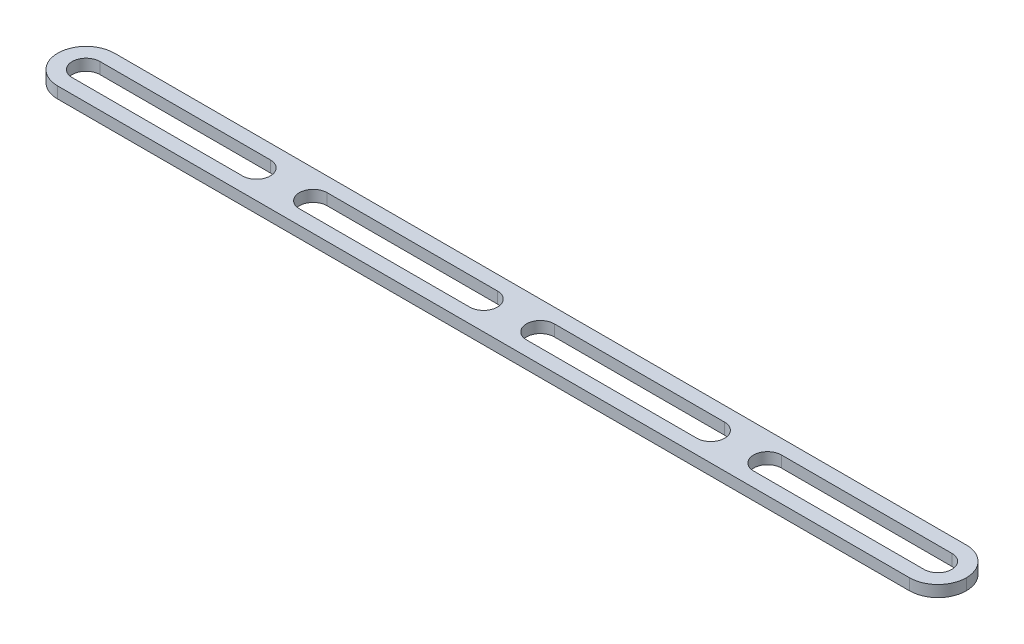
ISO-10303-21;
HEADER;
FILE_DESCRIPTION(('STEP AP214'),'2;1');
FILE_NAME('part.step','',(''),(''),'','','');
FILE_SCHEMA(('AUTOMOTIVE_DESIGN { 1 0 10303 214 1 1 1 1 }'));
ENDSEC;
DATA;
#1=APPLICATION_CONTEXT('core data for automotive mechanical design processes');
#2=APPLICATION_PROTOCOL_DEFINITION('international standard','automotive_design',2000,#1);
#3=PRODUCT_CONTEXT('',#1,'mechanical');
#4=PRODUCT('Part','Part','',(#3));
#5=PRODUCT_RELATED_PRODUCT_CATEGORY('part','',(#4));
#6=PRODUCT_DEFINITION_FORMATION('','',#4);
#7=PRODUCT_DEFINITION_CONTEXT('part definition',#1,'design');
#8=PRODUCT_DEFINITION('design','',#6,#7);
#9=PRODUCT_DEFINITION_SHAPE('','',#8);
#10=(LENGTH_UNIT() NAMED_UNIT(*) SI_UNIT(.MILLI.,.METRE.));
#11=(NAMED_UNIT(*) PLANE_ANGLE_UNIT() SI_UNIT($,.RADIAN.));
#12=(NAMED_UNIT(*) SI_UNIT($,.STERADIAN.) SOLID_ANGLE_UNIT());
#13=UNCERTAINTY_MEASURE_WITH_UNIT(LENGTH_MEASURE(1.E-05),#10,'distance_accuracy_value','');
#14=(GEOMETRIC_REPRESENTATION_CONTEXT(3) GLOBAL_UNCERTAINTY_ASSIGNED_CONTEXT((#13)) GLOBAL_UNIT_ASSIGNED_CONTEXT((#10,
#11,#12)) REPRESENTATION_CONTEXT('',''));
#15=CARTESIAN_POINT('',(0.,0.,0.));
#16=DIRECTION('',(0.,0.,1.));
#17=DIRECTION('',(1.,0.,0.));
#18=AXIS2_PLACEMENT_3D('',#15,#16,#17);
#19=CARTESIAN_POINT('',(0.,2.,0.));
#20=DIRECTION('',(0.,0.,-1.));
#21=DIRECTION('',(-1.,0.,0.));
#22=AXIS2_PLACEMENT_3D('',#19,#20,#21);
#23=PLANE('',#22);
#24=DIRECTION('',(1.,0.,0.));
#25=VECTOR('',#24,1.);
#26=CARTESIAN_POINT('',(0.,2.,0.));
#27=LINE('',#26,#25);
#28=CARTESIAN_POINT('',(5.,2.,0.));
#29=VERTEX_POINT('',#28);
#30=CARTESIAN_POINT('',(155.,2.,0.));
#31=VERTEX_POINT('',#30);
#32=EDGE_CURVE('E271',#29,#31,#27,.T.);
#33=ORIENTED_EDGE('',*,*,#32,.F.);
#34=DIRECTION('',(0.,-1.,0.));
#35=VECTOR('',#34,1.);
#36=CARTESIAN_POINT('',(5.,2.,0.));
#37=LINE('',#36,#35);
#38=CARTESIAN_POINT('',(5.,0.,0.));
#39=VERTEX_POINT('',#38);
#40=EDGE_CURVE('E286',#29,#39,#37,.T.);
#41=ORIENTED_EDGE('',*,*,#40,.T.);
#42=DIRECTION('',(1.,0.,0.));
#43=VECTOR('',#42,1.);
#44=CARTESIAN_POINT('',(0.,0.,0.));
#45=LINE('',#44,#43);
#46=CARTESIAN_POINT('',(155.,0.,0.));
#47=VERTEX_POINT('',#46);
#48=EDGE_CURVE('E279',#39,#47,#45,.T.);
#49=ORIENTED_EDGE('',*,*,#48,.T.);
#50=DIRECTION('',(0.,-1.,0.));
#51=VECTOR('',#50,1.);
#52=CARTESIAN_POINT('',(155.,2.,0.));
#53=LINE('',#52,#51);
#54=EDGE_CURVE('E278',#47,#31,#53,.F.);
#55=ORIENTED_EDGE('',*,*,#54,.T.);
#56=EDGE_LOOP('',(#33,#41,#49,#55));
#57=FACE_BOUND('',#56,.T.);
#58=ADVANCED_FACE('F34',(#57),#23,.F.);
#59=CARTESIAN_POINT('',(0.,2.,-10.));
#60=DIRECTION('',(0.,0.,1.));
#61=DIRECTION('',(1.,0.,0.));
#62=AXIS2_PLACEMENT_3D('',#59,#60,#61);
#63=PLANE('',#62);
#64=DIRECTION('',(-1.,0.,0.));
#65=VECTOR('',#64,1.);
#66=CARTESIAN_POINT('',(0.,0.,-10.));
#67=LINE('',#66,#65);
#68=CARTESIAN_POINT('',(155.,0.,-10.));
#69=VERTEX_POINT('',#68);
#70=CARTESIAN_POINT('',(5.,0.,-10.));
#71=VERTEX_POINT('',#70);
#72=EDGE_CURVE('E275',#69,#71,#67,.T.);
#73=ORIENTED_EDGE('',*,*,#72,.T.);
#74=DIRECTION('',(0.,-1.,0.));
#75=VECTOR('',#74,1.);
#76=CARTESIAN_POINT('',(5.,2.,-10.));
#77=LINE('',#76,#75);
#78=CARTESIAN_POINT('',(5.,2.,-10.));
#79=VERTEX_POINT('',#78);
#80=EDGE_CURVE('E308',#71,#79,#77,.F.);
#81=ORIENTED_EDGE('',*,*,#80,.T.);
#82=DIRECTION('',(-1.,0.,0.));
#83=VECTOR('',#82,1.);
#84=CARTESIAN_POINT('',(0.,2.,-10.));
#85=LINE('',#84,#83);
#86=CARTESIAN_POINT('',(155.,2.,-10.));
#87=VERTEX_POINT('',#86);
#88=EDGE_CURVE('E274',#87,#79,#85,.T.);
#89=ORIENTED_EDGE('',*,*,#88,.F.);
#90=DIRECTION('',(0.,-1.,0.));
#91=VECTOR('',#90,1.);
#92=CARTESIAN_POINT('',(155.,2.,-10.));
#93=LINE('',#92,#91);
#94=EDGE_CURVE('E305',#87,#69,#93,.T.);
#95=ORIENTED_EDGE('',*,*,#94,.T.);
#96=EDGE_LOOP('',(#73,#81,#89,#95));
#97=FACE_BOUND('',#96,.T.);
#98=ADVANCED_FACE('F366',(#97),#63,.F.);
#99=CARTESIAN_POINT('',(0.,2.,0.));
#100=DIRECTION('',(0.,-1.,0.));
#101=DIRECTION('',(0.,0.,-1.));
#102=AXIS2_PLACEMENT_3D('',#99,#100,#101);
#103=PLANE('',#102);
#104=DIRECTION('',(1.,0.,0.));
#105=VECTOR('',#104,1.);
#106=CARTESIAN_POINT('',(125.,2.,-2.55));
#107=LINE('',#106,#105);
#108=CARTESIAN_POINT('',(125.,2.,-2.55));
#109=VERTEX_POINT('',#108);
#110=CARTESIAN_POINT('',(155.,2.,-2.55));
#111=VERTEX_POINT('',#110);
#112=EDGE_CURVE('E194',#109,#111,#107,.T.);
#113=ORIENTED_EDGE('',*,*,#112,.F.);
#114=CARTESIAN_POINT('',(125.,2.,-5.));
#115=DIRECTION('',(0.,1.,0.));
#116=DIRECTION('',(0.,0.,1.));
#117=AXIS2_PLACEMENT_3D('',#114,#115,#116);
#118=CIRCLE('',#117,2.45);
#119=CARTESIAN_POINT('',(125.,2.,-7.45));
#120=VERTEX_POINT('',#119);
#121=EDGE_CURVE('E49',#120,#109,#118,.T.);
#122=ORIENTED_EDGE('',*,*,#121,.F.);
#123=DIRECTION('',(-1.,0.,0.));
#124=VECTOR('',#123,1.);
#125=CARTESIAN_POINT('',(125.,2.,-7.45));
#126=LINE('',#125,#124);
#127=CARTESIAN_POINT('',(155.,2.,-7.45));
#128=VERTEX_POINT('',#127);
#129=EDGE_CURVE('E201',#128,#120,#126,.T.);
#130=ORIENTED_EDGE('',*,*,#129,.F.);
#131=CARTESIAN_POINT('',(155.,2.,-5.));
#132=DIRECTION('',(0.,1.,0.));
#133=DIRECTION('',(0.,0.,1.));
#134=AXIS2_PLACEMENT_3D('',#131,#132,#133);
#135=CIRCLE('',#134,2.45);
#136=EDGE_CURVE('E185',#111,#128,#135,.T.);
#137=ORIENTED_EDGE('',*,*,#136,.F.);
#138=EDGE_LOOP('',(#113,#122,#130,#137));
#139=FACE_BOUND('',#138,.T.);
#140=DIRECTION('',(1.,0.,0.));
#141=VECTOR('',#140,1.);
#142=CARTESIAN_POINT('',(85.,2.,-2.55));
#143=LINE('',#142,#141);
#144=CARTESIAN_POINT('',(85.,2.,-2.55));
#145=VERTEX_POINT('',#144);
#146=CARTESIAN_POINT('',(115.,2.,-2.55));
#147=VERTEX_POINT('',#146);
#148=EDGE_CURVE('E212',#145,#147,#143,.T.);
#149=ORIENTED_EDGE('',*,*,#148,.F.);
#150=CARTESIAN_POINT('',(85.,2.,-5.));
#151=DIRECTION('',(0.,1.,0.));
#152=DIRECTION('',(0.,0.,1.));
#153=AXIS2_PLACEMENT_3D('',#150,#151,#152);
#154=CIRCLE('',#153,2.45);
#155=CARTESIAN_POINT('',(85.,2.,-7.45));
#156=VERTEX_POINT('',#155);
#157=EDGE_CURVE('E208',#156,#145,#154,.T.);
#158=ORIENTED_EDGE('',*,*,#157,.F.);
#159=DIRECTION('',(-1.,0.,0.));
#160=VECTOR('',#159,1.);
#161=CARTESIAN_POINT('',(85.,2.,-7.45));
#162=LINE('',#161,#160);
#163=CARTESIAN_POINT('',(115.,2.,-7.45));
#164=VERTEX_POINT('',#163);
#165=EDGE_CURVE('E218',#164,#156,#162,.T.);
#166=ORIENTED_EDGE('',*,*,#165,.F.);
#167=CARTESIAN_POINT('',(115.,2.,-5.));
#168=DIRECTION('',(0.,1.,0.));
#169=DIRECTION('',(0.,0.,1.));
#170=AXIS2_PLACEMENT_3D('',#167,#168,#169);
#171=CIRCLE('',#170,2.45);
#172=EDGE_CURVE('E215',#147,#164,#171,.T.);
#173=ORIENTED_EDGE('',*,*,#172,.F.);
#174=EDGE_LOOP('',(#149,#158,#166,#173));
#175=FACE_BOUND('',#174,.T.);
#176=DIRECTION('',(1.,0.,0.));
#177=VECTOR('',#176,1.);
#178=CARTESIAN_POINT('',(45.,2.,-2.55));
#179=LINE('',#178,#177);
#180=CARTESIAN_POINT('',(45.,2.,-2.55));
#181=VERTEX_POINT('',#180);
#182=CARTESIAN_POINT('',(75.,2.,-2.55));
#183=VERTEX_POINT('',#182);
#184=EDGE_CURVE('E232',#181,#183,#179,.T.);
#185=ORIENTED_EDGE('',*,*,#184,.F.);
#186=CARTESIAN_POINT('',(45.,2.,-5.));
#187=DIRECTION('',(0.,1.,0.));
#188=DIRECTION('',(0.,0.,1.));
#189=AXIS2_PLACEMENT_3D('',#186,#187,#188);
#190=CIRCLE('',#189,2.45);
#191=CARTESIAN_POINT('',(45.,2.,-7.45));
#192=VERTEX_POINT('',#191);
#193=EDGE_CURVE('E224',#192,#181,#190,.T.);
#194=ORIENTED_EDGE('',*,*,#193,.F.);
#195=DIRECTION('',(-1.,0.,0.));
#196=VECTOR('',#195,1.);
#197=CARTESIAN_POINT('',(45.,2.,-7.45));
#198=LINE('',#197,#196);
#199=CARTESIAN_POINT('',(75.,2.,-7.45));
#200=VERTEX_POINT('',#199);
#201=EDGE_CURVE('E238',#200,#192,#198,.T.);
#202=ORIENTED_EDGE('',*,*,#201,.F.);
#203=CARTESIAN_POINT('',(75.,2.,-5.));
#204=DIRECTION('',(0.,1.,0.));
#205=DIRECTION('',(0.,0.,1.));
#206=AXIS2_PLACEMENT_3D('',#203,#204,#205);
#207=CIRCLE('',#206,2.45);
#208=EDGE_CURVE('E235',#183,#200,#207,.T.);
#209=ORIENTED_EDGE('',*,*,#208,.F.);
#210=EDGE_LOOP('',(#185,#194,#202,#209));
#211=FACE_BOUND('',#210,.T.);
#212=DIRECTION('',(1.,0.,0.));
#213=VECTOR('',#212,1.);
#214=CARTESIAN_POINT('',(5.,2.,-2.55));
#215=LINE('',#214,#213);
#216=CARTESIAN_POINT('',(5.,2.,-2.55));
#217=VERTEX_POINT('',#216);
#218=CARTESIAN_POINT('',(35.,2.,-2.55));
#219=VERTEX_POINT('',#218);
#220=EDGE_CURVE('E252',#217,#219,#215,.T.);
#221=ORIENTED_EDGE('',*,*,#220,.F.);
#222=CARTESIAN_POINT('',(5.,2.,-5.));
#223=DIRECTION('',(0.,1.,0.));
#224=DIRECTION('',(0.,0.,1.));
#225=AXIS2_PLACEMENT_3D('',#222,#223,#224);
#226=CIRCLE('',#225,2.45);
#227=CARTESIAN_POINT('',(5.,2.,-7.45));
#228=VERTEX_POINT('',#227);
#229=EDGE_CURVE('E244',#228,#217,#226,.T.);
#230=ORIENTED_EDGE('',*,*,#229,.F.);
#231=DIRECTION('',(-1.,0.,0.));
#232=VECTOR('',#231,1.);
#233=CARTESIAN_POINT('',(5.,2.,-7.45));
#234=LINE('',#233,#232);
#235=CARTESIAN_POINT('',(35.,2.,-7.45));
#236=VERTEX_POINT('',#235);
#237=EDGE_CURVE('E258',#236,#228,#234,.T.);
#238=ORIENTED_EDGE('',*,*,#237,.F.);
#239=CARTESIAN_POINT('',(35.,2.,-5.));
#240=DIRECTION('',(0.,1.,0.));
#241=DIRECTION('',(0.,0.,1.));
#242=AXIS2_PLACEMENT_3D('',#239,#240,#241);
#243=CIRCLE('',#242,2.45);
#244=EDGE_CURVE('E255',#219,#236,#243,.T.);
#245=ORIENTED_EDGE('',*,*,#244,.F.);
#246=EDGE_LOOP('',(#221,#230,#238,#245));
#247=FACE_BOUND('',#246,.T.);
#248=CARTESIAN_POINT('',(5.,2.,-5.));
#249=DIRECTION('',(0.,-1.,0.));
#250=DIRECTION('',(0.,0.,-1.));
#251=AXIS2_PLACEMENT_3D('',#248,#249,#250);
#252=CIRCLE('',#251,5.);
#253=CARTESIAN_POINT('',(0.,2.,-5.));
#254=VERTEX_POINT('',#253);
#255=EDGE_CURVE('E301',#79,#254,#252,.F.);
#256=ORIENTED_EDGE('',*,*,#255,.T.);
#257=CARTESIAN_POINT('',(5.,2.,-5.));
#258=DIRECTION('',(0.,-1.,0.));
#259=DIRECTION('',(0.,0.,-1.));
#260=AXIS2_PLACEMENT_3D('',#257,#258,#259);
#261=CIRCLE('',#260,5.);
#262=EDGE_CURVE('E303',#254,#29,#261,.F.);
#263=ORIENTED_EDGE('',*,*,#262,.T.);
#264=ORIENTED_EDGE('',*,*,#32,.T.);
#265=CARTESIAN_POINT('',(155.,2.,-5.));
#266=DIRECTION('',(0.,-1.,0.));
#267=DIRECTION('',(0.,0.,-1.));
#268=AXIS2_PLACEMENT_3D('',#265,#266,#267);
#269=CIRCLE('',#268,5.);
#270=CARTESIAN_POINT('',(160.,2.,-5.));
#271=VERTEX_POINT('',#270);
#272=EDGE_CURVE('E297',#31,#271,#269,.F.);
#273=ORIENTED_EDGE('',*,*,#272,.T.);
#274=CARTESIAN_POINT('',(155.,2.,-5.));
#275=DIRECTION('',(0.,-1.,0.));
#276=DIRECTION('',(0.,0.,-1.));
#277=AXIS2_PLACEMENT_3D('',#274,#275,#276);
#278=CIRCLE('',#277,5.);
#279=EDGE_CURVE('E299',#271,#87,#278,.F.);
#280=ORIENTED_EDGE('',*,*,#279,.T.);
#281=ORIENTED_EDGE('',*,*,#88,.T.);
#282=EDGE_LOOP('',(#256,#263,#264,#273,#280,#281));
#283=FACE_BOUND('',#282,.T.);
#284=ADVANCED_FACE('F198',(#139,#175,#211,#247,#283),#103,.F.);
#285=CARTESIAN_POINT('',(0.,0.,0.));
#286=DIRECTION('',(0.,-1.,0.));
#287=DIRECTION('',(0.,0.,-1.));
#288=AXIS2_PLACEMENT_3D('',#285,#286,#287);
#289=PLANE('',#288);
#290=CARTESIAN_POINT('',(125.,0.,-5.));
#291=DIRECTION('',(0.,-1.,0.));
#292=DIRECTION('',(0.,0.,-1.));
#293=AXIS2_PLACEMENT_3D('',#290,#291,#292);
#294=CIRCLE('',#293,2.45);
#295=CARTESIAN_POINT('',(125.,0.,-2.55));
#296=VERTEX_POINT('',#295);
#297=CARTESIAN_POINT('',(125.,0.,-7.45));
#298=VERTEX_POINT('',#297);
#299=EDGE_CURVE('E11',#296,#298,#294,.T.);
#300=ORIENTED_EDGE('',*,*,#299,.F.);
#301=DIRECTION('',(-1.,0.,0.));
#302=VECTOR('',#301,1.);
#303=CARTESIAN_POINT('',(0.,0.,-2.55));
#304=LINE('',#303,#302);
#305=CARTESIAN_POINT('',(155.,0.,-2.55));
#306=VERTEX_POINT('',#305);
#307=EDGE_CURVE('E341',#306,#296,#304,.T.);
#308=ORIENTED_EDGE('',*,*,#307,.F.);
#309=CARTESIAN_POINT('',(155.,0.,-5.));
#310=DIRECTION('',(0.,-1.,0.));
#311=DIRECTION('',(0.,0.,-1.));
#312=AXIS2_PLACEMENT_3D('',#309,#310,#311);
#313=CIRCLE('',#312,2.45);
#314=CARTESIAN_POINT('',(155.,0.,-7.45));
#315=VERTEX_POINT('',#314);
#316=EDGE_CURVE('E188',#315,#306,#313,.T.);
#317=ORIENTED_EDGE('',*,*,#316,.F.);
#318=DIRECTION('',(1.,0.,0.));
#319=VECTOR('',#318,1.);
#320=CARTESIAN_POINT('',(0.,0.,-7.45));
#321=LINE('',#320,#319);
#322=EDGE_CURVE('E42',#298,#315,#321,.T.);
#323=ORIENTED_EDGE('',*,*,#322,.F.);
#324=EDGE_LOOP('',(#300,#308,#317,#323));
#325=FACE_BOUND('',#324,.T.);
#326=CARTESIAN_POINT('',(85.,0.,-5.));
#327=DIRECTION('',(0.,-1.,0.));
#328=DIRECTION('',(0.,0.,-1.));
#329=AXIS2_PLACEMENT_3D('',#326,#327,#328);
#330=CIRCLE('',#329,2.45);
#331=CARTESIAN_POINT('',(85.,0.,-2.55));
#332=VERTEX_POINT('',#331);
#333=CARTESIAN_POINT('',(85.,0.,-7.45));
#334=VERTEX_POINT('',#333);
#335=EDGE_CURVE('E339',#332,#334,#330,.T.);
#336=ORIENTED_EDGE('',*,*,#335,.F.);
#337=DIRECTION('',(-1.,0.,0.));
#338=VECTOR('',#337,1.);
#339=CARTESIAN_POINT('',(0.,0.,-2.55));
#340=LINE('',#339,#338);
#341=CARTESIAN_POINT('',(115.,0.,-2.55));
#342=VERTEX_POINT('',#341);
#343=EDGE_CURVE('E332',#342,#332,#340,.T.);
#344=ORIENTED_EDGE('',*,*,#343,.F.);
#345=CARTESIAN_POINT('',(115.,0.,-5.));
#346=DIRECTION('',(0.,-1.,0.));
#347=DIRECTION('',(0.,0.,-1.));
#348=AXIS2_PLACEMENT_3D('',#345,#346,#347);
#349=CIRCLE('',#348,2.45);
#350=CARTESIAN_POINT('',(115.,0.,-7.45));
#351=VERTEX_POINT('',#350);
#352=EDGE_CURVE('E334',#351,#342,#349,.T.);
#353=ORIENTED_EDGE('',*,*,#352,.F.);
#354=DIRECTION('',(1.,0.,0.));
#355=VECTOR('',#354,1.);
#356=CARTESIAN_POINT('',(0.,0.,-7.45));
#357=LINE('',#356,#355);
#358=EDGE_CURVE('E337',#334,#351,#357,.T.);
#359=ORIENTED_EDGE('',*,*,#358,.F.);
#360=EDGE_LOOP('',(#336,#344,#353,#359));
#361=FACE_BOUND('',#360,.T.);
#362=CARTESIAN_POINT('',(45.,0.,-5.));
#363=DIRECTION('',(0.,-1.,0.));
#364=DIRECTION('',(0.,0.,-1.));
#365=AXIS2_PLACEMENT_3D('',#362,#363,#364);
#366=CIRCLE('',#365,2.45);
#367=CARTESIAN_POINT('',(45.,0.,-2.55));
#368=VERTEX_POINT('',#367);
#369=CARTESIAN_POINT('',(45.,0.,-7.45));
#370=VERTEX_POINT('',#369);
#371=EDGE_CURVE('E330',#368,#370,#366,.T.);
#372=ORIENTED_EDGE('',*,*,#371,.F.);
#373=DIRECTION('',(-1.,0.,0.));
#374=VECTOR('',#373,1.);
#375=CARTESIAN_POINT('',(0.,0.,-2.55));
#376=LINE('',#375,#374);
#377=CARTESIAN_POINT('',(75.,0.,-2.55));
#378=VERTEX_POINT('',#377);
#379=EDGE_CURVE('E323',#378,#368,#376,.T.);
#380=ORIENTED_EDGE('',*,*,#379,.F.);
#381=CARTESIAN_POINT('',(75.,0.,-5.));
#382=DIRECTION('',(0.,-1.,0.));
#383=DIRECTION('',(0.,0.,-1.));
#384=AXIS2_PLACEMENT_3D('',#381,#382,#383);
#385=CIRCLE('',#384,2.45);
#386=CARTESIAN_POINT('',(75.,0.,-7.45));
#387=VERTEX_POINT('',#386);
#388=EDGE_CURVE('E325',#387,#378,#385,.T.);
#389=ORIENTED_EDGE('',*,*,#388,.F.);
#390=DIRECTION('',(1.,0.,0.));
#391=VECTOR('',#390,1.);
#392=CARTESIAN_POINT('',(0.,0.,-7.45));
#393=LINE('',#392,#391);
#394=EDGE_CURVE('E328',#370,#387,#393,.T.);
#395=ORIENTED_EDGE('',*,*,#394,.F.);
#396=EDGE_LOOP('',(#372,#380,#389,#395));
#397=FACE_BOUND('',#396,.T.);
#398=CARTESIAN_POINT('',(5.,0.,-5.));
#399=DIRECTION('',(0.,-1.,0.));
#400=DIRECTION('',(0.,0.,-1.));
#401=AXIS2_PLACEMENT_3D('',#398,#399,#400);
#402=CIRCLE('',#401,2.45);
#403=CARTESIAN_POINT('',(5.,0.,-2.55));
#404=VERTEX_POINT('',#403);
#405=CARTESIAN_POINT('',(5.,0.,-7.45));
#406=VERTEX_POINT('',#405);
#407=EDGE_CURVE('E321',#404,#406,#402,.T.);
#408=ORIENTED_EDGE('',*,*,#407,.F.);
#409=DIRECTION('',(-1.,0.,0.));
#410=VECTOR('',#409,1.);
#411=CARTESIAN_POINT('',(0.,0.,-2.55));
#412=LINE('',#411,#410);
#413=CARTESIAN_POINT('',(35.,0.,-2.55));
#414=VERTEX_POINT('',#413);
#415=EDGE_CURVE('E310',#414,#404,#412,.T.);
#416=ORIENTED_EDGE('',*,*,#415,.F.);
#417=CARTESIAN_POINT('',(35.,0.,-5.));
#418=DIRECTION('',(0.,-1.,0.));
#419=DIRECTION('',(0.,0.,-1.));
#420=AXIS2_PLACEMENT_3D('',#417,#418,#419);
#421=CIRCLE('',#420,2.45);
#422=CARTESIAN_POINT('',(35.,0.,-7.45));
#423=VERTEX_POINT('',#422);
#424=EDGE_CURVE('E316',#423,#414,#421,.T.);
#425=ORIENTED_EDGE('',*,*,#424,.F.);
#426=DIRECTION('',(1.,0.,0.));
#427=VECTOR('',#426,1.);
#428=CARTESIAN_POINT('',(0.,0.,-7.45));
#429=LINE('',#428,#427);
#430=EDGE_CURVE('E319',#406,#423,#429,.T.);
#431=ORIENTED_EDGE('',*,*,#430,.F.);
#432=EDGE_LOOP('',(#408,#416,#425,#431));
#433=FACE_BOUND('',#432,.T.);
#434=ORIENTED_EDGE('',*,*,#48,.F.);
#435=CARTESIAN_POINT('',(5.,0.,-5.));
#436=DIRECTION('',(0.,-1.,0.));
#437=DIRECTION('',(0.,0.,-1.));
#438=AXIS2_PLACEMENT_3D('',#435,#436,#437);
#439=CIRCLE('',#438,5.);
#440=CARTESIAN_POINT('',(0.,0.,-5.));
#441=VERTEX_POINT('',#440);
#442=EDGE_CURVE('E295',#39,#441,#439,.T.);
#443=ORIENTED_EDGE('',*,*,#442,.T.);
#444=CARTESIAN_POINT('',(5.,0.,-5.));
#445=DIRECTION('',(0.,-1.,0.));
#446=DIRECTION('',(0.,0.,-1.));
#447=AXIS2_PLACEMENT_3D('',#444,#445,#446);
#448=CIRCLE('',#447,5.);
#449=EDGE_CURVE('E293',#441,#71,#448,.T.);
#450=ORIENTED_EDGE('',*,*,#449,.T.);
#451=ORIENTED_EDGE('',*,*,#72,.F.);
#452=CARTESIAN_POINT('',(155.,0.,-5.));
#453=DIRECTION('',(0.,-1.,0.));
#454=DIRECTION('',(0.,0.,-1.));
#455=AXIS2_PLACEMENT_3D('',#452,#453,#454);
#456=CIRCLE('',#455,5.);
#457=CARTESIAN_POINT('',(160.,0.,-5.));
#458=VERTEX_POINT('',#457);
#459=EDGE_CURVE('E291',#69,#458,#456,.T.);
#460=ORIENTED_EDGE('',*,*,#459,.T.);
#461=CARTESIAN_POINT('',(155.,0.,-5.));
#462=DIRECTION('',(0.,-1.,0.));
#463=DIRECTION('',(0.,0.,-1.));
#464=AXIS2_PLACEMENT_3D('',#461,#462,#463);
#465=CIRCLE('',#464,5.);
#466=EDGE_CURVE('E289',#458,#47,#465,.T.);
#467=ORIENTED_EDGE('',*,*,#466,.T.);
#468=EDGE_LOOP('',(#434,#443,#450,#451,#460,#467));
#469=FACE_BOUND('',#468,.T.);
#470=ADVANCED_FACE('F349',(#325,#361,#397,#433,#469),#289,.T.);
#471=CARTESIAN_POINT('',(5.,2.,-5.));
#472=DIRECTION('',(0.,-1.,0.));
#473=DIRECTION('',(0.,0.,-1.));
#474=AXIS2_PLACEMENT_3D('',#471,#472,#473);
#475=CYLINDRICAL_SURFACE('',#474,5.);
#476=DIRECTION('',(0.,-1.,0.));
#477=VECTOR('',#476,1.);
#478=CARTESIAN_POINT('',(0.,2.,-5.));
#479=LINE('',#478,#477);
#480=EDGE_CURVE('E282',#254,#441,#479,.T.);
#481=ORIENTED_EDGE('',*,*,#480,.F.);
#482=ORIENTED_EDGE('',*,*,#255,.F.);
#483=ORIENTED_EDGE('',*,*,#80,.F.);
#484=ORIENTED_EDGE('',*,*,#449,.F.);
#485=EDGE_LOOP('',(#481,#482,#483,#484));
#486=FACE_BOUND('',#485,.T.);
#487=ADVANCED_FACE('F380',(#486),#475,.T.);
#488=CARTESIAN_POINT('',(5.,2.,-5.));
#489=DIRECTION('',(0.,-1.,0.));
#490=DIRECTION('',(0.,0.,-1.));
#491=AXIS2_PLACEMENT_3D('',#488,#489,#490);
#492=CYLINDRICAL_SURFACE('',#491,5.);
#493=ORIENTED_EDGE('',*,*,#262,.F.);
#494=ORIENTED_EDGE('',*,*,#480,.T.);
#495=ORIENTED_EDGE('',*,*,#442,.F.);
#496=ORIENTED_EDGE('',*,*,#40,.F.);
#497=EDGE_LOOP('',(#493,#494,#495,#496));
#498=FACE_BOUND('',#497,.T.);
#499=ADVANCED_FACE('F377',(#498),#492,.T.);
#500=CARTESIAN_POINT('',(155.,2.,-5.));
#501=DIRECTION('',(0.,-1.,0.));
#502=DIRECTION('',(0.,0.,-1.));
#503=AXIS2_PLACEMENT_3D('',#500,#501,#502);
#504=CYLINDRICAL_SURFACE('',#503,5.);
#505=DIRECTION('',(0.,-1.,0.));
#506=VECTOR('',#505,1.);
#507=CARTESIAN_POINT('',(160.,2.,-5.));
#508=LINE('',#507,#506);
#509=EDGE_CURVE('E264',#271,#458,#508,.T.);
#510=ORIENTED_EDGE('',*,*,#509,.F.);
#511=ORIENTED_EDGE('',*,*,#272,.F.);
#512=ORIENTED_EDGE('',*,*,#54,.F.);
#513=ORIENTED_EDGE('',*,*,#466,.F.);
#514=EDGE_LOOP('',(#510,#511,#512,#513));
#515=FACE_BOUND('',#514,.T.);
#516=ADVANCED_FACE('F36',(#515),#504,.T.);
#517=CARTESIAN_POINT('',(155.,2.,-5.));
#518=DIRECTION('',(0.,-1.,0.));
#519=DIRECTION('',(0.,0.,-1.));
#520=AXIS2_PLACEMENT_3D('',#517,#518,#519);
#521=CYLINDRICAL_SURFACE('',#520,5.);
#522=ORIENTED_EDGE('',*,*,#279,.F.);
#523=ORIENTED_EDGE('',*,*,#509,.T.);
#524=ORIENTED_EDGE('',*,*,#459,.F.);
#525=ORIENTED_EDGE('',*,*,#94,.F.);
#526=EDGE_LOOP('',(#522,#523,#524,#525));
#527=FACE_BOUND('',#526,.T.);
#528=ADVANCED_FACE('F384',(#527),#521,.T.);
#529=CARTESIAN_POINT('',(5.,-8.,-5.));
#530=DIRECTION('',(0.,1.,0.));
#531=DIRECTION('',(0.,0.,1.));
#532=AXIS2_PLACEMENT_3D('',#529,#530,#531);
#533=CYLINDRICAL_SURFACE('',#532,2.45);
#534=ORIENTED_EDGE('',*,*,#407,.T.);
#535=DIRECTION('',(0.,1.,0.));
#536=VECTOR('',#535,1.);
#537=CARTESIAN_POINT('',(5.,-8.,-7.45));
#538=LINE('',#537,#536);
#539=EDGE_CURVE('E262',#406,#228,#538,.T.);
#540=ORIENTED_EDGE('',*,*,#539,.T.);
#541=ORIENTED_EDGE('',*,*,#229,.T.);
#542=DIRECTION('',(0.,1.,0.));
#543=VECTOR('',#542,1.);
#544=CARTESIAN_POINT('',(5.,-8.,-2.55));
#545=LINE('',#544,#543);
#546=EDGE_CURVE('E261',#404,#217,#545,.T.);
#547=ORIENTED_EDGE('',*,*,#546,.F.);
#548=EDGE_LOOP('',(#534,#540,#541,#547));
#549=FACE_BOUND('',#548,.T.);
#550=ADVANCED_FACE('F386',(#549),#533,.F.);
#551=CARTESIAN_POINT('',(5.,-8.,-7.45));
#552=DIRECTION('',(0.,0.,-1.));
#553=DIRECTION('',(-1.,0.,0.));
#554=AXIS2_PLACEMENT_3D('',#551,#552,#553);
#555=PLANE('',#554);
#556=ORIENTED_EDGE('',*,*,#430,.T.);
#557=DIRECTION('',(0.,1.,0.));
#558=VECTOR('',#557,1.);
#559=CARTESIAN_POINT('',(35.,-8.,-7.45));
#560=LINE('',#559,#558);
#561=EDGE_CURVE('E265',#423,#236,#560,.T.);
#562=ORIENTED_EDGE('',*,*,#561,.T.);
#563=ORIENTED_EDGE('',*,*,#237,.T.);
#564=ORIENTED_EDGE('',*,*,#539,.F.);
#565=EDGE_LOOP('',(#556,#562,#563,#564));
#566=FACE_BOUND('',#565,.T.);
#567=ADVANCED_FACE('F392',(#566),#555,.F.);
#568=CARTESIAN_POINT('',(35.,-8.,-5.));
#569=DIRECTION('',(0.,1.,0.));
#570=DIRECTION('',(0.,0.,1.));
#571=AXIS2_PLACEMENT_3D('',#568,#569,#570);
#572=CYLINDRICAL_SURFACE('',#571,2.45);
#573=ORIENTED_EDGE('',*,*,#424,.T.);
#574=DIRECTION('',(0.,1.,0.));
#575=VECTOR('',#574,1.);
#576=CARTESIAN_POINT('',(35.,-8.,-2.55));
#577=LINE('',#576,#575);
#578=EDGE_CURVE('E267',#414,#219,#577,.T.);
#579=ORIENTED_EDGE('',*,*,#578,.T.);
#580=ORIENTED_EDGE('',*,*,#244,.T.);
#581=ORIENTED_EDGE('',*,*,#561,.F.);
#582=EDGE_LOOP('',(#573,#579,#580,#581));
#583=FACE_BOUND('',#582,.T.);
#584=ADVANCED_FACE('F423',(#583),#572,.F.);
#585=CARTESIAN_POINT('',(5.,-8.,-2.55));
#586=DIRECTION('',(0.,0.,1.));
#587=DIRECTION('',(1.,0.,0.));
#588=AXIS2_PLACEMENT_3D('',#585,#586,#587);
#589=PLANE('',#588);
#590=ORIENTED_EDGE('',*,*,#415,.T.);
#591=ORIENTED_EDGE('',*,*,#546,.T.);
#592=ORIENTED_EDGE('',*,*,#220,.T.);
#593=ORIENTED_EDGE('',*,*,#578,.F.);
#594=EDGE_LOOP('',(#590,#591,#592,#593));
#595=FACE_BOUND('',#594,.T.);
#596=ADVANCED_FACE('F419',(#595),#589,.F.);
#597=CARTESIAN_POINT('',(45.,-8.,-5.));
#598=DIRECTION('',(0.,1.,0.));
#599=DIRECTION('',(0.,0.,1.));
#600=AXIS2_PLACEMENT_3D('',#597,#598,#599);
#601=CYLINDRICAL_SURFACE('',#600,2.45);
#602=ORIENTED_EDGE('',*,*,#371,.T.);
#603=DIRECTION('',(0.,1.,0.));
#604=VECTOR('',#603,1.);
#605=CARTESIAN_POINT('',(45.,-8.,-7.45));
#606=LINE('',#605,#604);
#607=EDGE_CURVE('E242',#370,#192,#606,.T.);
#608=ORIENTED_EDGE('',*,*,#607,.T.);
#609=ORIENTED_EDGE('',*,*,#193,.T.);
#610=DIRECTION('',(0.,1.,0.));
#611=VECTOR('',#610,1.);
#612=CARTESIAN_POINT('',(45.,-8.,-2.55));
#613=LINE('',#612,#611);
#614=EDGE_CURVE('E241',#368,#181,#613,.T.);
#615=ORIENTED_EDGE('',*,*,#614,.F.);
#616=EDGE_LOOP('',(#602,#608,#609,#615));
#617=FACE_BOUND('',#616,.T.);
#618=ADVANCED_FACE('F422',(#617),#601,.F.);
#619=CARTESIAN_POINT('',(45.,-8.,-7.45));
#620=DIRECTION('',(0.,0.,-1.));
#621=DIRECTION('',(-1.,0.,0.));
#622=AXIS2_PLACEMENT_3D('',#619,#620,#621);
#623=PLANE('',#622);
#624=ORIENTED_EDGE('',*,*,#394,.T.);
#625=DIRECTION('',(0.,1.,0.));
#626=VECTOR('',#625,1.);
#627=CARTESIAN_POINT('',(75.,-8.,-7.45));
#628=LINE('',#627,#626);
#629=EDGE_CURVE('E245',#387,#200,#628,.T.);
#630=ORIENTED_EDGE('',*,*,#629,.T.);
#631=ORIENTED_EDGE('',*,*,#201,.T.);
#632=ORIENTED_EDGE('',*,*,#607,.F.);
#633=EDGE_LOOP('',(#624,#630,#631,#632));
#634=FACE_BOUND('',#633,.T.);
#635=ADVANCED_FACE('F433',(#634),#623,.F.);
#636=CARTESIAN_POINT('',(75.,-8.,-5.));
#637=DIRECTION('',(0.,1.,0.));
#638=DIRECTION('',(0.,0.,1.));
#639=AXIS2_PLACEMENT_3D('',#636,#637,#638);
#640=CYLINDRICAL_SURFACE('',#639,2.45);
#641=ORIENTED_EDGE('',*,*,#388,.T.);
#642=DIRECTION('',(0.,1.,0.));
#643=VECTOR('',#642,1.);
#644=CARTESIAN_POINT('',(75.,-8.,-2.55));
#645=LINE('',#644,#643);
#646=EDGE_CURVE('E247',#378,#183,#645,.T.);
#647=ORIENTED_EDGE('',*,*,#646,.T.);
#648=ORIENTED_EDGE('',*,*,#208,.T.);
#649=ORIENTED_EDGE('',*,*,#629,.F.);
#650=EDGE_LOOP('',(#641,#647,#648,#649));
#651=FACE_BOUND('',#650,.T.);
#652=ADVANCED_FACE('F439',(#651),#640,.F.);
#653=CARTESIAN_POINT('',(45.,-8.,-2.55));
#654=DIRECTION('',(0.,0.,1.));
#655=DIRECTION('',(1.,0.,0.));
#656=AXIS2_PLACEMENT_3D('',#653,#654,#655);
#657=PLANE('',#656);
#658=ORIENTED_EDGE('',*,*,#379,.T.);
#659=ORIENTED_EDGE('',*,*,#614,.T.);
#660=ORIENTED_EDGE('',*,*,#184,.T.);
#661=ORIENTED_EDGE('',*,*,#646,.F.);
#662=EDGE_LOOP('',(#658,#659,#660,#661));
#663=FACE_BOUND('',#662,.T.);
#664=ADVANCED_FACE('F435',(#663),#657,.F.);
#665=CARTESIAN_POINT('',(85.,-8.,-5.));
#666=DIRECTION('',(0.,1.,0.));
#667=DIRECTION('',(0.,0.,1.));
#668=AXIS2_PLACEMENT_3D('',#665,#666,#667);
#669=CYLINDRICAL_SURFACE('',#668,2.45);
#670=ORIENTED_EDGE('',*,*,#335,.T.);
#671=DIRECTION('',(0.,1.,0.));
#672=VECTOR('',#671,1.);
#673=CARTESIAN_POINT('',(85.,-8.,-7.45));
#674=LINE('',#673,#672);
#675=EDGE_CURVE('E222',#334,#156,#674,.T.);
#676=ORIENTED_EDGE('',*,*,#675,.T.);
#677=ORIENTED_EDGE('',*,*,#157,.T.);
#678=DIRECTION('',(0.,1.,0.));
#679=VECTOR('',#678,1.);
#680=CARTESIAN_POINT('',(85.,-8.,-2.55));
#681=LINE('',#680,#679);
#682=EDGE_CURVE('E221',#332,#145,#681,.T.);
#683=ORIENTED_EDGE('',*,*,#682,.F.);
#684=EDGE_LOOP('',(#670,#676,#677,#683));
#685=FACE_BOUND('',#684,.T.);
#686=ADVANCED_FACE('F438',(#685),#669,.F.);
#687=CARTESIAN_POINT('',(85.,-8.,-7.45));
#688=DIRECTION('',(0.,0.,-1.));
#689=DIRECTION('',(-1.,0.,0.));
#690=AXIS2_PLACEMENT_3D('',#687,#688,#689);
#691=PLANE('',#690);
#692=ORIENTED_EDGE('',*,*,#358,.T.);
#693=DIRECTION('',(0.,1.,0.));
#694=VECTOR('',#693,1.);
#695=CARTESIAN_POINT('',(115.,-8.,-7.45));
#696=LINE('',#695,#694);
#697=EDGE_CURVE('E225',#351,#164,#696,.T.);
#698=ORIENTED_EDGE('',*,*,#697,.T.);
#699=ORIENTED_EDGE('',*,*,#165,.T.);
#700=ORIENTED_EDGE('',*,*,#675,.F.);
#701=EDGE_LOOP('',(#692,#698,#699,#700));
#702=FACE_BOUND('',#701,.T.);
#703=ADVANCED_FACE('F448',(#702),#691,.F.);
#704=CARTESIAN_POINT('',(115.,-8.,-5.));
#705=DIRECTION('',(0.,1.,0.));
#706=DIRECTION('',(0.,0.,1.));
#707=AXIS2_PLACEMENT_3D('',#704,#705,#706);
#708=CYLINDRICAL_SURFACE('',#707,2.45);
#709=ORIENTED_EDGE('',*,*,#352,.T.);
#710=DIRECTION('',(0.,1.,0.));
#711=VECTOR('',#710,1.);
#712=CARTESIAN_POINT('',(115.,-8.,-2.55));
#713=LINE('',#712,#711);
#714=EDGE_CURVE('E227',#342,#147,#713,.T.);
#715=ORIENTED_EDGE('',*,*,#714,.T.);
#716=ORIENTED_EDGE('',*,*,#172,.T.);
#717=ORIENTED_EDGE('',*,*,#697,.F.);
#718=EDGE_LOOP('',(#709,#715,#716,#717));
#719=FACE_BOUND('',#718,.T.);
#720=ADVANCED_FACE('F360',(#719),#708,.F.);
#721=CARTESIAN_POINT('',(85.,-8.,-2.55));
#722=DIRECTION('',(0.,0.,1.));
#723=DIRECTION('',(1.,0.,0.));
#724=AXIS2_PLACEMENT_3D('',#721,#722,#723);
#725=PLANE('',#724);
#726=ORIENTED_EDGE('',*,*,#343,.T.);
#727=ORIENTED_EDGE('',*,*,#682,.T.);
#728=ORIENTED_EDGE('',*,*,#148,.T.);
#729=ORIENTED_EDGE('',*,*,#714,.F.);
#730=EDGE_LOOP('',(#726,#727,#728,#729));
#731=FACE_BOUND('',#730,.T.);
#732=ADVANCED_FACE('F353',(#731),#725,.F.);
#733=CARTESIAN_POINT('',(125.,-8.,-5.));
#734=DIRECTION('',(0.,1.,0.));
#735=DIRECTION('',(0.,0.,1.));
#736=AXIS2_PLACEMENT_3D('',#733,#734,#735);
#737=CYLINDRICAL_SURFACE('',#736,2.45);
#738=ORIENTED_EDGE('',*,*,#299,.T.);
#739=DIRECTION('',(0.,1.,0.));
#740=VECTOR('',#739,1.);
#741=CARTESIAN_POINT('',(125.,-8.,-7.45));
#742=LINE('',#741,#740);
#743=EDGE_CURVE('E206',#298,#120,#742,.T.);
#744=ORIENTED_EDGE('',*,*,#743,.T.);
#745=ORIENTED_EDGE('',*,*,#121,.T.);
#746=DIRECTION('',(0.,1.,0.));
#747=VECTOR('',#746,1.);
#748=CARTESIAN_POINT('',(125.,-8.,-2.55));
#749=LINE('',#748,#747);
#750=EDGE_CURVE('E191',#296,#109,#749,.T.);
#751=ORIENTED_EDGE('',*,*,#750,.F.);
#752=EDGE_LOOP('',(#738,#744,#745,#751));
#753=FACE_BOUND('',#752,.T.);
#754=ADVANCED_FACE('F351',(#753),#737,.F.);
#755=CARTESIAN_POINT('',(125.,-8.,-7.45));
#756=DIRECTION('',(0.,0.,-1.));
#757=DIRECTION('',(-1.,0.,0.));
#758=AXIS2_PLACEMENT_3D('',#755,#756,#757);
#759=PLANE('',#758);
#760=ORIENTED_EDGE('',*,*,#322,.T.);
#761=DIRECTION('',(0.,1.,0.));
#762=VECTOR('',#761,1.);
#763=CARTESIAN_POINT('',(155.,-8.,-7.45));
#764=LINE('',#763,#762);
#765=EDGE_CURVE('E190',#315,#128,#764,.T.);
#766=ORIENTED_EDGE('',*,*,#765,.T.);
#767=ORIENTED_EDGE('',*,*,#129,.T.);
#768=ORIENTED_EDGE('',*,*,#743,.F.);
#769=EDGE_LOOP('',(#760,#766,#767,#768));
#770=FACE_BOUND('',#769,.T.);
#771=ADVANCED_FACE('F346',(#770),#759,.F.);
#772=CARTESIAN_POINT('',(155.,-8.,-5.));
#773=DIRECTION('',(0.,1.,0.));
#774=DIRECTION('',(0.,0.,1.));
#775=AXIS2_PLACEMENT_3D('',#772,#773,#774);
#776=CYLINDRICAL_SURFACE('',#775,2.45);
#777=ORIENTED_EDGE('',*,*,#316,.T.);
#778=DIRECTION('',(0.,1.,0.));
#779=VECTOR('',#778,1.);
#780=CARTESIAN_POINT('',(155.,-8.,-2.55));
#781=LINE('',#780,#779);
#782=EDGE_CURVE('E57',#306,#111,#781,.T.);
#783=ORIENTED_EDGE('',*,*,#782,.T.);
#784=ORIENTED_EDGE('',*,*,#136,.T.);
#785=ORIENTED_EDGE('',*,*,#765,.F.);
#786=EDGE_LOOP('',(#777,#783,#784,#785));
#787=FACE_BOUND('',#786,.T.);
#788=ADVANCED_FACE('F182',(#787),#776,.F.);
#789=CARTESIAN_POINT('',(125.,-8.,-2.55));
#790=DIRECTION('',(0.,0.,1.));
#791=DIRECTION('',(1.,0.,0.));
#792=AXIS2_PLACEMENT_3D('',#789,#790,#791);
#793=PLANE('',#792);
#794=ORIENTED_EDGE('',*,*,#307,.T.);
#795=ORIENTED_EDGE('',*,*,#750,.T.);
#796=ORIENTED_EDGE('',*,*,#112,.T.);
#797=ORIENTED_EDGE('',*,*,#782,.F.);
#798=EDGE_LOOP('',(#794,#795,#796,#797));
#799=FACE_BOUND('',#798,.T.);
#800=ADVANCED_FACE('F195',(#799),#793,.F.);
#801=CLOSED_SHELL('',(#58,#98,#284,#470,#487,#499,#516,#528,#550,#567,#584,#596,#618,#635,#652,
#664,#686,#703,#720,#732,#754,#771,#788,#800));
#802=MANIFOLD_SOLID_BREP('B2',#801);
#803=ADVANCED_BREP_SHAPE_REPRESENTATION('',(#18,#802),#14);
#804=SHAPE_DEFINITION_REPRESENTATION(#9,#803);
ENDSEC;
END-ISO-10303-21;
